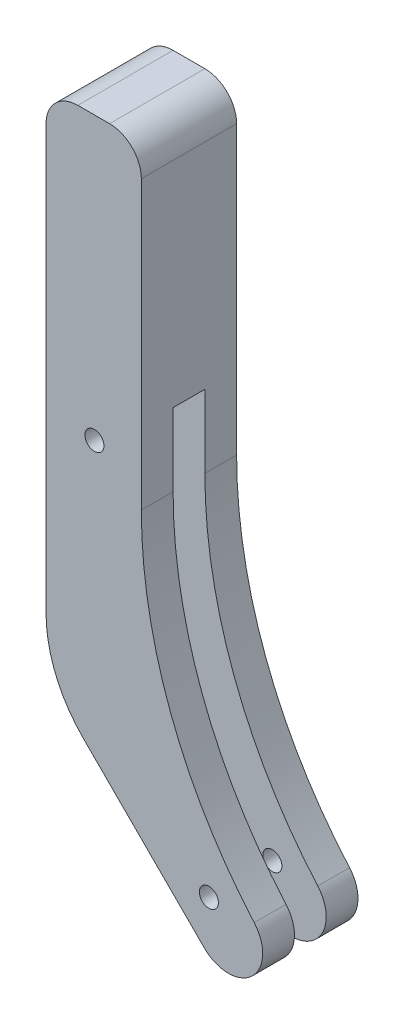
ISO-10303-21;
HEADER;
FILE_DESCRIPTION(('STEP AP214'),'2;1');
FILE_NAME('part.step','',(''),(''),'','','');
FILE_SCHEMA(('AUTOMOTIVE_DESIGN { 1 0 10303 214 1 1 1 1 }'));
ENDSEC;
DATA;
#1=APPLICATION_CONTEXT('core data for automotive mechanical design processes');
#2=APPLICATION_PROTOCOL_DEFINITION('international standard','automotive_design',2000,#1);
#3=PRODUCT_CONTEXT('',#1,'mechanical');
#4=PRODUCT('Part','Part','',(#3));
#5=PRODUCT_RELATED_PRODUCT_CATEGORY('part','',(#4));
#6=PRODUCT_DEFINITION_FORMATION('','',#4);
#7=PRODUCT_DEFINITION_CONTEXT('part definition',#1,'design');
#8=PRODUCT_DEFINITION('design','',#6,#7);
#9=PRODUCT_DEFINITION_SHAPE('','',#8);
#10=(LENGTH_UNIT() NAMED_UNIT(*) SI_UNIT(.MILLI.,.METRE.));
#11=(NAMED_UNIT(*) PLANE_ANGLE_UNIT() SI_UNIT($,.RADIAN.));
#12=(NAMED_UNIT(*) SI_UNIT($,.STERADIAN.) SOLID_ANGLE_UNIT());
#13=UNCERTAINTY_MEASURE_WITH_UNIT(LENGTH_MEASURE(1.E-05),#10,'distance_accuracy_value','');
#14=(GEOMETRIC_REPRESENTATION_CONTEXT(3) GLOBAL_UNCERTAINTY_ASSIGNED_CONTEXT((#13)) GLOBAL_UNIT_ASSIGNED_CONTEXT((#10,
#11,#12)) REPRESENTATION_CONTEXT('',''));
#15=CARTESIAN_POINT('',(0.,0.,0.));
#16=DIRECTION('',(0.,0.,1.));
#17=DIRECTION('',(1.,0.,0.));
#18=AXIS2_PLACEMENT_3D('',#15,#16,#17);
#19=CARTESIAN_POINT('',(32.7735875325626,-17.542182630838,5.49999999999998));
#20=CARTESIAN_POINT('',(32.7735875325626,-17.542182630838,5.33333333333328));
#21=CARTESIAN_POINT('',(32.7735875306768,-17.5421826286791,5.16666666666668));
#22=CARTESIAN_POINT('',(32.7735875306768,-17.5421826286791,3.33333333333311));
#23=CARTESIAN_POINT('',(32.7735875306768,-17.5421826286791,1.66666666666562));
#24=CARTESIAN_POINT('',(32.7735875306768,-17.5421826286791,-0.166666666666562));
#25=CARTESIAN_POINT('',(32.7735875325626,-17.542182630838,-0.333333333333409));
#26=CARTESIAN_POINT('',(32.7735875325626,-17.542182630838,-0.499999999999997));
#27=CARTESIAN_POINT('',(39.4151061792394,-25.1457185349327,5.49999999999998));
#28=CARTESIAN_POINT('',(39.4151061792394,-25.1457185349327,5.33333333333328));
#29=CARTESIAN_POINT('',(39.4151061848913,-25.1457185364542,5.16666666666668));
#30=CARTESIAN_POINT('',(39.4151061848913,-25.1457185364542,3.33333333333311));
#31=CARTESIAN_POINT('',(39.4151061848913,-25.1457185364542,1.66666666666562));
#32=CARTESIAN_POINT('',(39.4151061848913,-25.1457185364542,-0.166666666666562));
#33=CARTESIAN_POINT('',(39.4151061792394,-25.1457185349327,-0.333333333333409));
#34=CARTESIAN_POINT('',(39.4151061792394,-25.1457185349327,-0.499999999999997));
#35=CARTESIAN_POINT('',(32.0397712806244,-32.0397712838038,5.49999999999998));
#36=CARTESIAN_POINT('',(32.0397712806244,-32.0397712838038,5.33333333333328));
#37=CARTESIAN_POINT('',(32.0397712808825,-32.0397712898168,5.16666666666668));
#38=CARTESIAN_POINT('',(32.0397712808825,-32.0397712898168,3.33333333333311));
#39=CARTESIAN_POINT('',(32.0397712808825,-32.0397712898168,1.66666666666562));
#40=CARTESIAN_POINT('',(32.0397712808825,-32.0397712898168,-0.166666666666562));
#41=CARTESIAN_POINT('',(32.0397712806244,-32.0397712838038,-0.333333333333409));
#42=CARTESIAN_POINT('',(32.0397712806244,-32.0397712838038,-0.499999999999997));
#43=CARTESIAN_POINT('',(24.9010204048193,-24.9010204048192,5.49999999999998));
#44=CARTESIAN_POINT('',(24.9010204048193,-24.9010204048192,5.33333333333328));
#45=CARTESIAN_POINT('',(24.9010204024885,-24.9010204024884,5.16666666666668));
#46=CARTESIAN_POINT('',(24.9010204024885,-24.9010204024884,3.33333333333311));
#47=CARTESIAN_POINT('',(24.9010204024885,-24.9010204024884,1.66666666666562));
#48=CARTESIAN_POINT('',(24.9010204024885,-24.9010204024884,-0.166666666666562));
#49=CARTESIAN_POINT('',(24.9010204048193,-24.9010204048192,-0.333333333333409));
#50=CARTESIAN_POINT('',(24.9010204048193,-24.9010204048192,-0.499999999999997));
#51=(BOUNDED_SURFACE() B_SPLINE_SURFACE(3,3,((#19,#20,#21,#22,#23,#24,#25,#26),(#27,#28,#29,#30,
#31,#32,#33,#34),(#35,#36,#37,#38,#39,#40,#41,#42),(#43,#44,#45,#46,#47,#48,#49,#50)),
.UNSPECIFIED.,.F.,.F.,.F.) B_SPLINE_SURFACE_WITH_KNOTS((4,4),(4,2,2,4),(0.,1.),
(-0.0999999999999964,0.,1.,1.1),
.UNSPECIFIED.) GEOMETRIC_REPRESENTATION_ITEM() RATIONAL_B_SPLINE_SURFACE(((1.,1.,1.,1.,1.,1.,1.,
1.),(0.355806085913103,0.355806085913103,0.355806085671384,0.355806085671384,0.355806085671384,
0.355806085671384,0.355806085913103,0.355806085913103),(0.355806085913103,0.355806085913103,
0.355806085671384,0.355806085671384,0.355806085671384,0.355806085671384,0.355806085913103,
0.355806085913103),(1.,1.,1.,1.,1.,1.,1.,1.))) REPRESENTATION_ITEM('') SURFACE());
#52=CARTESIAN_POINT('',(24.9010204048193,-24.9010204048192,5.49999999999998));
#53=CARTESIAN_POINT('',(24.9010204048193,-24.9010204048192,5.33333333333328));
#54=CARTESIAN_POINT('',(24.9010204024885,-24.9010204024884,5.16666666666668));
#55=CARTESIAN_POINT('',(24.9010204024885,-24.9010204024884,3.33333333333311));
#56=CARTESIAN_POINT('',(24.9010204024885,-24.9010204024884,1.66666666666562));
#57=CARTESIAN_POINT('',(24.9010204024885,-24.9010204024884,-0.166666666666562));
#58=CARTESIAN_POINT('',(24.9010204048193,-24.9010204048192,-0.333333333333409));
#59=CARTESIAN_POINT('',(24.9010204048193,-24.9010204048192,-0.499999999999997));
#60=(BOUNDED_CURVE() B_SPLINE_CURVE(3,(#52,#53,#54,#55,#56,#57,#58,#59),.UNSPECIFIED.,.F.,
.F.) B_SPLINE_CURVE_WITH_KNOTS((4,2,2,4),(-0.0999999999999964,0.,1.,1.1),
.UNSPECIFIED.) CURVE() GEOMETRIC_REPRESENTATION_ITEM() RATIONAL_B_SPLINE_CURVE((1.,1.,1.,1.,1.,
1.,1.,1.)) REPRESENTATION_ITEM(''));
#61=CARTESIAN_POINT('',(24.9010204024885,-24.9010204024884,0.));
#62=VERTEX_POINT('',#61);
#63=CARTESIAN_POINT('',(24.9010204024885,-24.9010204024884,4.99999999999999));
#64=VERTEX_POINT('',#63);
#65=EDGE_CURVE('E233',#62,#64,#60,.F.);
#66=CARTESIAN_POINT('',(24.9010204024885,-24.9010204024884,0.));
#67=CARTESIAN_POINT('',(32.0397712808825,-32.0397712898168,0.));
#68=CARTESIAN_POINT('',(39.4151061848913,-25.1457185364542,0.));
#69=CARTESIAN_POINT('',(32.7735875306768,-17.5421826286791,0.));
#70=(BOUNDED_CURVE() B_SPLINE_CURVE(3,(#66,#67,#68,#69),.UNSPECIFIED.,.F.,
.F.) B_SPLINE_CURVE_WITH_KNOTS((4,4),(0.,1.),
.UNSPECIFIED.) CURVE() GEOMETRIC_REPRESENTATION_ITEM() RATIONAL_B_SPLINE_CURVE((1.,
0.355806085671384,0.355806085671384,1.)) REPRESENTATION_ITEM(''));
#71=CARTESIAN_POINT('',(32.7735875306768,-17.5421826286791,0.));
#72=VERTEX_POINT('',#71);
#73=EDGE_CURVE('E48',#72,#62,#70,.F.);
#74=CARTESIAN_POINT('',(32.7735875325626,-17.542182630838,-0.499999999999997));
#75=CARTESIAN_POINT('',(32.7735875325626,-17.542182630838,-0.333333333333409));
#76=CARTESIAN_POINT('',(32.7735875306768,-17.5421826286791,-0.166666666666562));
#77=CARTESIAN_POINT('',(32.7735875306768,-17.5421826286791,1.66666666666562));
#78=CARTESIAN_POINT('',(32.7735875306768,-17.5421826286791,3.33333333333311));
#79=CARTESIAN_POINT('',(32.7735875306768,-17.5421826286791,5.16666666666668));
#80=CARTESIAN_POINT('',(32.7735875325626,-17.542182630838,5.33333333333328));
#81=CARTESIAN_POINT('',(32.7735875325626,-17.542182630838,5.49999999999998));
#82=(BOUNDED_CURVE() B_SPLINE_CURVE(3,(#74,#75,#76,#77,#78,#79,#80,#81),.UNSPECIFIED.,.F.,
.F.) B_SPLINE_CURVE_WITH_KNOTS((4,2,2,4),(-0.0999999999999963,0.,1.,1.1),
.UNSPECIFIED.) CURVE() GEOMETRIC_REPRESENTATION_ITEM() RATIONAL_B_SPLINE_CURVE((1.,1.,1.,1.,1.,
1.,1.,1.)) REPRESENTATION_ITEM(''));
#83=CARTESIAN_POINT('',(32.7735875306768,-17.5421826286791,5.));
#84=VERTEX_POINT('',#83);
#85=EDGE_CURVE('E338',#84,#72,#82,.F.);
#86=CARTESIAN_POINT('',(32.7735875306768,-17.5421826286791,5.));
#87=CARTESIAN_POINT('',(39.4151061848913,-25.1457185364542,5.));
#88=CARTESIAN_POINT('',(32.0397712808825,-32.0397712898168,5.));
#89=CARTESIAN_POINT('',(24.9010204024885,-24.9010204024884,5.));
#90=(BOUNDED_CURVE() B_SPLINE_CURVE(3,(#86,#87,#88,#89),.UNSPECIFIED.,.F.,
.F.) B_SPLINE_CURVE_WITH_KNOTS((4,4),(0.,1.),
.UNSPECIFIED.) CURVE() GEOMETRIC_REPRESENTATION_ITEM() RATIONAL_B_SPLINE_CURVE((1.,
0.355806085671384,0.355806085671384,1.)) REPRESENTATION_ITEM(''));
#91=EDGE_CURVE('E11',#64,#84,#90,.F.);
#92=ORIENTED_EDGE('',*,*,#65,.F.);
#93=ORIENTED_EDGE('',*,*,#73,.F.);
#94=ORIENTED_EDGE('',*,*,#85,.F.);
#95=ORIENTED_EDGE('',*,*,#91,.F.);
#96=EDGE_LOOP('',(#92,#93,#94,#95));
#97=FACE_BOUND('',#96,.T.);
#98=ADVANCED_FACE('F35',(#97),#51,.T.);
#99=CARTESIAN_POINT('',(32.7735875325626,-17.542182630838,15.5));
#100=CARTESIAN_POINT('',(32.7735875325898,-17.5421826308692,15.3333333333344));
#101=CARTESIAN_POINT('',(32.7735875306469,-17.5421826286449,15.1666666666652));
#102=CARTESIAN_POINT('',(32.773587530976,-17.5421826290216,13.3333333333476));
#103=CARTESIAN_POINT('',(32.7735875333082,-17.5421826316916,11.6666666666671));
#104=CARTESIAN_POINT('',(32.7735875336341,-17.5421826320647,9.83333333333329));
#105=CARTESIAN_POINT('',(32.7735875335713,-17.5421826319928,9.66666666666674));
#106=CARTESIAN_POINT('',(32.7735875336045,-17.5421826320308,9.50000000000002));
#107=CARTESIAN_POINT('',(39.4151061792394,-25.1457185349327,15.5));
#108=CARTESIAN_POINT('',(39.4151061791578,-25.145718534909,15.3333333333327));
#109=CARTESIAN_POINT('',(39.4151061849821,-25.1457185364776,15.1666666666712));
#110=CARTESIAN_POINT('',(39.4151061839835,-25.14571853622,13.3333333336872));
#111=CARTESIAN_POINT('',(39.4151061769957,-25.1457185343147,11.6666666670207));
#112=CARTESIAN_POINT('',(39.4151061760289,-25.1457185340698,9.83333333333682));
#113=CARTESIAN_POINT('',(39.4151061762255,-25.1457185341164,9.66666666666674));
#114=CARTESIAN_POINT('',(39.4151061761168,-25.1457185340921,9.50000000000002));
#115=CARTESIAN_POINT('',(32.0397712806244,-32.0397712838038,15.5));
#116=CARTESIAN_POINT('',(32.0397712806221,-32.0397712837165,15.3333333333327));
#117=CARTESIAN_POINT('',(32.0397712808877,-32.0397712899128,15.1666666666712));
#118=CARTESIAN_POINT('',(32.0397712808304,-32.0397712888569,13.3333333336872));
#119=CARTESIAN_POINT('',(32.0397712805338,-32.0397712814126,11.6666666670207));
#120=CARTESIAN_POINT('',(32.0397712804766,-32.0397712803886,9.83333333333682));
#121=CARTESIAN_POINT('',(32.0397712804968,-32.0397712805927,9.66666666666674));
#122=CARTESIAN_POINT('',(32.0397712804818,-32.0397712804817,9.50000000000002));
#123=CARTESIAN_POINT('',(24.9010204048193,-24.9010204048192,15.5));
#124=CARTESIAN_POINT('',(24.9010204048543,-24.9010204048542,15.3333333333344));
#125=CARTESIAN_POINT('',(24.901020402452,-24.9010204024519,15.1666666666652));
#126=CARTESIAN_POINT('',(24.9010204028528,-24.9010204028527,13.3333333333476));
#127=CARTESIAN_POINT('',(24.9010204057514,-24.9010204057513,11.6666666666671));
#128=CARTESIAN_POINT('',(24.9010204061426,-24.9010204061425,9.83333333333329));
#129=CARTESIAN_POINT('',(24.9010204060712,-24.9010204060711,9.66666666666674));
#130=CARTESIAN_POINT('',(24.901020406107,-24.9010204061069,9.50000000000002));
#131=(BOUNDED_SURFACE() B_SPLINE_SURFACE(3,3,((#99,#100,#101,#102,#103,#104,#105,#106),(#107,
#108,#109,#110,#111,#112,#113,#114),(#115,#116,#117,#118,#119,#120,#121,#122),(#123,#124,#125,
#126,#127,#128,#129,#130)),.UNSPECIFIED.,.F.,.F.,.F.) B_SPLINE_SURFACE_WITH_KNOTS((4,4),(4,2,2,
4),(0.,1.),(-0.0999999999999996,0.,0.999999999999996,1.1),
.UNSPECIFIED.) GEOMETRIC_REPRESENTATION_ITEM() RATIONAL_B_SPLINE_SURFACE(((1.,1.,1.,1.,1.,1.,1.,
1.),(0.355806085913103,0.355806085913103,0.35580608566364,0.355806085748822,0.355806085971154,
0.355806086054199,0.355806086046649,0.355806086046649),(0.355806085913103,0.355806085913103,
0.35580608566364,0.355806085748822,0.355806085971154,0.355806086054199,0.355806086046649,
0.355806086046649),(1.,1.,1.,1.,1.,1.,1.,1.))) REPRESENTATION_ITEM('') SURFACE());
#132=CARTESIAN_POINT('',(24.9010204048193,-24.9010204048192,15.5));
#133=CARTESIAN_POINT('',(24.9010204048543,-24.9010204048542,15.3333333333344));
#134=CARTESIAN_POINT('',(24.901020402452,-24.9010204024519,15.1666666666652));
#135=CARTESIAN_POINT('',(24.9010204028528,-24.9010204028527,13.3333333333476));
#136=CARTESIAN_POINT('',(24.9010204057514,-24.9010204057513,11.6666666666671));
#137=CARTESIAN_POINT('',(24.9010204061426,-24.9010204061425,9.83333333333329));
#138=CARTESIAN_POINT('',(24.9010204060712,-24.9010204060711,9.66666666666674));
#139=CARTESIAN_POINT('',(24.901020406107,-24.9010204061069,9.50000000000002));
#140=(BOUNDED_CURVE() B_SPLINE_CURVE(3,(#132,#133,#134,#135,#136,#137,#138,#139),.UNSPECIFIED.,
.F.,.F.) B_SPLINE_CURVE_WITH_KNOTS((4,2,2,4),(-0.0999999999999996,0.,0.999999999999996,1.1),
.UNSPECIFIED.) CURVE() GEOMETRIC_REPRESENTATION_ITEM() RATIONAL_B_SPLINE_CURVE((1.,1.,1.,1.,1.,
1.,1.,1.)) REPRESENTATION_ITEM(''));
#141=CARTESIAN_POINT('',(24.901020406107,-24.9010204061069,9.99999999999999));
#142=VERTEX_POINT('',#141);
#143=CARTESIAN_POINT('',(24.9010204024885,-24.9010204024884,15.));
#144=VERTEX_POINT('',#143);
#145=EDGE_CURVE('E321',#142,#144,#140,.F.);
#146=CARTESIAN_POINT('',(24.901020406107,-24.9010204061069,10.));
#147=CARTESIAN_POINT('',(32.0397712804818,-32.0397712804817,10.));
#148=CARTESIAN_POINT('',(39.4151061761168,-25.1457185340921,10.));
#149=CARTESIAN_POINT('',(32.7735875336045,-17.5421826320308,10.));
#150=(BOUNDED_CURVE() B_SPLINE_CURVE(3,(#146,#147,#148,#149),.UNSPECIFIED.,.F.,
.F.) B_SPLINE_CURVE_WITH_KNOTS((4,4),(0.,1.),
.UNSPECIFIED.) CURVE() GEOMETRIC_REPRESENTATION_ITEM() RATIONAL_B_SPLINE_CURVE((1.,
0.35580608604665,0.35580608604665,1.)) REPRESENTATION_ITEM(''));
#151=CARTESIAN_POINT('',(32.7735875336045,-17.5421826320308,10.));
#152=VERTEX_POINT('',#151);
#153=EDGE_CURVE('E329',#152,#142,#150,.F.);
#154=CARTESIAN_POINT('',(32.7735875336045,-17.5421826320308,9.50000000000002));
#155=CARTESIAN_POINT('',(32.7735875335713,-17.5421826319928,9.66666666666674));
#156=CARTESIAN_POINT('',(32.7735875336341,-17.5421826320647,9.83333333333329));
#157=CARTESIAN_POINT('',(32.7735875333082,-17.5421826316916,11.6666666666671));
#158=CARTESIAN_POINT('',(32.773587530976,-17.5421826290216,13.3333333333476));
#159=CARTESIAN_POINT('',(32.7735875306469,-17.5421826286449,15.1666666666652));
#160=CARTESIAN_POINT('',(32.7735875325898,-17.5421826308692,15.3333333333344));
#161=CARTESIAN_POINT('',(32.7735875325626,-17.542182630838,15.5));
#162=(BOUNDED_CURVE() B_SPLINE_CURVE(3,(#154,#155,#156,#157,#158,#159,#160,#161),.UNSPECIFIED.,
.F.,.F.) B_SPLINE_CURVE_WITH_KNOTS((4,2,2,4),(-0.0999999999999996,0.,0.999999999999996,1.1),
.UNSPECIFIED.) CURVE() GEOMETRIC_REPRESENTATION_ITEM() RATIONAL_B_SPLINE_CURVE((1.,1.,1.,1.,1.,
1.,1.,1.)) REPRESENTATION_ITEM(''));
#163=CARTESIAN_POINT('',(32.7735875306768,-17.5421826286791,15.));
#164=VERTEX_POINT('',#163);
#165=EDGE_CURVE('E324',#164,#152,#162,.F.);
#166=CARTESIAN_POINT('',(32.7735875306768,-17.5421826286791,15.));
#167=CARTESIAN_POINT('',(39.4151061848913,-25.1457185364542,15.));
#168=CARTESIAN_POINT('',(32.0397712808825,-32.0397712898168,15.));
#169=CARTESIAN_POINT('',(24.9010204024885,-24.9010204024884,15.));
#170=(BOUNDED_CURVE() B_SPLINE_CURVE(3,(#166,#167,#168,#169),.UNSPECIFIED.,.F.,
.F.) B_SPLINE_CURVE_WITH_KNOTS((4,4),(0.,1.),
.UNSPECIFIED.) CURVE() GEOMETRIC_REPRESENTATION_ITEM() RATIONAL_B_SPLINE_CURVE((1.,
0.355806085671384,0.355806085671384,1.)) REPRESENTATION_ITEM(''));
#171=EDGE_CURVE('E334',#144,#164,#170,.F.);
#172=ORIENTED_EDGE('',*,*,#145,.F.);
#173=ORIENTED_EDGE('',*,*,#153,.F.);
#174=ORIENTED_EDGE('',*,*,#165,.F.);
#175=ORIENTED_EDGE('',*,*,#171,.F.);
#176=EDGE_LOOP('',(#172,#173,#174,#175));
#177=FACE_BOUND('',#176,.T.);
#178=ADVANCED_FACE('F252',(#177),#131,.T.);
#179=CARTESIAN_POINT('',(28.7132034355965,-28.7132034355964,15.));
#180=DIRECTION('',(0.707106781186546,0.707106781186549,0.));
#181=DIRECTION('',(-0.707106781186549,0.707106781186546,0.));
#182=AXIS2_PLACEMENT_3D('',#179,#180,#181);
#183=PLANE('',#182);
#184=DIRECTION('',(0.707106781186549,-0.707106781186546,0.));
#185=VECTOR('',#184,1.);
#186=CARTESIAN_POINT('',(28.7132034355965,-28.7132034355964,0.));
#187=LINE('',#186,#185);
#188=CARTESIAN_POINT('',(5.85786437626907,-5.85786437626905,0.));
#189=VERTEX_POINT('',#188);
#190=EDGE_CURVE('E222',#189,#62,#187,.T.);
#191=ORIENTED_EDGE('',*,*,#190,.T.);
#192=ORIENTED_EDGE('',*,*,#65,.T.);
#193=DIRECTION('',(0.707106781186549,-0.707106781186546,0.));
#194=VECTOR('',#193,1.);
#195=CARTESIAN_POINT('',(28.7132034355965,-28.7132034355964,4.99999999999999));
#196=LINE('',#195,#194);
#197=CARTESIAN_POINT('',(5.85786437626907,-5.85786437626905,5.));
#198=VERTEX_POINT('',#197);
#199=EDGE_CURVE('E226',#198,#64,#196,.T.);
#200=ORIENTED_EDGE('',*,*,#199,.F.);
#201=DIRECTION('',(0.,0.,-1.));
#202=VECTOR('',#201,1.);
#203=CARTESIAN_POINT('',(5.85786437626907,-5.85786437626905,15.));
#204=LINE('',#203,#202);
#205=EDGE_CURVE('E273',#198,#189,#204,.T.);
#206=ORIENTED_EDGE('',*,*,#205,.T.);
#207=EDGE_LOOP('',(#191,#192,#200,#206));
#208=FACE_BOUND('',#207,.T.);
#209=ADVANCED_FACE('F241',(#208),#183,.F.);
#210=DIRECTION('',(-0.707106781186549,0.707106781186546,0.));
#211=VECTOR('',#210,1.);
#212=CARTESIAN_POINT('',(28.7132034355965,-28.7132034355964,9.99999999999999));
#213=LINE('',#212,#211);
#214=CARTESIAN_POINT('',(5.85786437626907,-5.85786437626905,10.));
#215=VERTEX_POINT('',#214);
#216=EDGE_CURVE('E160',#142,#215,#213,.T.);
#217=ORIENTED_EDGE('',*,*,#216,.F.);
#218=ORIENTED_EDGE('',*,*,#145,.T.);
#219=DIRECTION('',(0.707106781186549,-0.707106781186546,0.));
#220=VECTOR('',#219,1.);
#221=CARTESIAN_POINT('',(28.7132034355965,-28.7132034355964,15.));
#222=LINE('',#221,#220);
#223=CARTESIAN_POINT('',(5.85786437626907,-5.85786437626905,15.));
#224=VERTEX_POINT('',#223);
#225=EDGE_CURVE('E196',#224,#144,#222,.T.);
#226=ORIENTED_EDGE('',*,*,#225,.F.);
#227=EDGE_CURVE('E282',#224,#215,#204,.T.);
#228=ORIENTED_EDGE('',*,*,#227,.T.);
#229=EDGE_LOOP('',(#217,#218,#226,#228));
#230=FACE_BOUND('',#229,.T.);
#231=ADVANCED_FACE('F251',(#230),#183,.F.);
#232=CARTESIAN_POINT('',(15.,80.,15.));
#233=DIRECTION('',(-1.,0.,0.));
#234=DIRECTION('',(0.,0.,1.));
#235=AXIS2_PLACEMENT_3D('',#232,#233,#234);
#236=PLANE('',#235);
#237=DIRECTION('',(0.,1.,0.));
#238=VECTOR('',#237,1.);
#239=CARTESIAN_POINT('',(15.,80.,0.));
#240=LINE('',#239,#238);
#241=CARTESIAN_POINT('',(15.,29.8233764908629,0.));
#242=VERTEX_POINT('',#241);
#243=CARTESIAN_POINT('',(15.,75.,0.));
#244=VERTEX_POINT('',#243);
#245=EDGE_CURVE('E219',#242,#244,#240,.T.);
#246=ORIENTED_EDGE('',*,*,#245,.T.);
#247=DIRECTION('',(0.,0.,-1.));
#248=VECTOR('',#247,1.);
#249=CARTESIAN_POINT('',(15.,75.,15.));
#250=LINE('',#249,#248);
#251=CARTESIAN_POINT('',(15.,75.,15.));
#252=VERTEX_POINT('',#251);
#253=EDGE_CURVE('E313',#244,#252,#250,.F.);
#254=ORIENTED_EDGE('',*,*,#253,.T.);
#255=DIRECTION('',(0.,1.,0.));
#256=VECTOR('',#255,1.);
#257=CARTESIAN_POINT('',(15.,80.,15.));
#258=LINE('',#257,#256);
#259=CARTESIAN_POINT('',(15.,29.8233764908629,15.));
#260=VERTEX_POINT('',#259);
#261=EDGE_CURVE('E200',#260,#252,#258,.T.);
#262=ORIENTED_EDGE('',*,*,#261,.F.);
#263=DIRECTION('',(0.,0.,-1.));
#264=VECTOR('',#263,1.);
#265=CARTESIAN_POINT('',(15.,29.8233764908629,0.));
#266=LINE('',#265,#264);
#267=CARTESIAN_POINT('',(15.,29.8233764908629,10.));
#268=VERTEX_POINT('',#267);
#269=EDGE_CURVE('E362',#260,#268,#266,.T.);
#270=ORIENTED_EDGE('',*,*,#269,.T.);
#271=DIRECTION('',(0.,-1.,0.));
#272=VECTOR('',#271,1.);
#273=CARTESIAN_POINT('',(15.,80.,10.));
#274=LINE('',#273,#272);
#275=CARTESIAN_POINT('',(15.,41.2867965644036,10.));
#276=VERTEX_POINT('',#275);
#277=EDGE_CURVE('E269',#276,#268,#274,.T.);
#278=ORIENTED_EDGE('',*,*,#277,.F.);
#279=DIRECTION('',(0.,0.,1.));
#280=VECTOR('',#279,1.);
#281=CARTESIAN_POINT('',(15.,41.2867965644036,15.));
#282=LINE('',#281,#280);
#283=CARTESIAN_POINT('',(15.,41.2867965644036,5.00000000000001));
#284=VERTEX_POINT('',#283);
#285=EDGE_CURVE('E207',#284,#276,#282,.T.);
#286=ORIENTED_EDGE('',*,*,#285,.F.);
#287=DIRECTION('',(0.,1.,0.));
#288=VECTOR('',#287,1.);
#289=CARTESIAN_POINT('',(15.,80.,5.00000000000001));
#290=LINE('',#289,#288);
#291=CARTESIAN_POINT('',(15.,29.8233764908629,5.));
#292=VERTEX_POINT('',#291);
#293=EDGE_CURVE('E157',#292,#284,#290,.T.);
#294=ORIENTED_EDGE('',*,*,#293,.F.);
#295=EDGE_CURVE('E216',#292,#242,#266,.T.);
#296=ORIENTED_EDGE('',*,*,#295,.T.);
#297=EDGE_LOOP('',(#246,#254,#262,#270,#278,#286,#294,#296));
#298=FACE_BOUND('',#297,.T.);
#299=ADVANCED_FACE('F253',(#298),#236,.F.);
#300=CARTESIAN_POINT('',(0.,0.,15.));
#301=DIRECTION('',(1.,0.,0.));
#302=DIRECTION('',(0.,0.,-1.));
#303=AXIS2_PLACEMENT_3D('',#300,#301,#302);
#304=PLANE('',#303);
#305=DIRECTION('',(0.,-1.,0.));
#306=VECTOR('',#305,1.);
#307=CARTESIAN_POINT('',(0.,0.,15.));
#308=LINE('',#307,#306);
#309=CARTESIAN_POINT('',(0.,75.,15.));
#310=VERTEX_POINT('',#309);
#311=CARTESIAN_POINT('',(0.,8.28427124746193,15.));
#312=VERTEX_POINT('',#311);
#313=EDGE_CURVE('E214',#310,#312,#308,.T.);
#314=ORIENTED_EDGE('',*,*,#313,.F.);
#315=DIRECTION('',(0.,0.,-1.));
#316=VECTOR('',#315,1.);
#317=CARTESIAN_POINT('',(0.,75.,15.));
#318=LINE('',#317,#316);
#319=CARTESIAN_POINT('',(0.,75.,0.));
#320=VERTEX_POINT('',#319);
#321=EDGE_CURVE('E194',#310,#320,#318,.T.);
#322=ORIENTED_EDGE('',*,*,#321,.T.);
#323=DIRECTION('',(0.,-1.,0.));
#324=VECTOR('',#323,1.);
#325=CARTESIAN_POINT('',(0.,0.,0.));
#326=LINE('',#325,#324);
#327=CARTESIAN_POINT('',(0.,8.28427124746193,0.));
#328=VERTEX_POINT('',#327);
#329=EDGE_CURVE('E201',#320,#328,#326,.T.);
#330=ORIENTED_EDGE('',*,*,#329,.T.);
#331=DIRECTION('',(0.,0.,-1.));
#332=VECTOR('',#331,1.);
#333=CARTESIAN_POINT('',(0.,8.28427124746193,15.));
#334=LINE('',#333,#332);
#335=CARTESIAN_POINT('',(0.,8.28427124746193,5.));
#336=VERTEX_POINT('',#335);
#337=EDGE_CURVE('E176',#328,#336,#334,.F.);
#338=ORIENTED_EDGE('',*,*,#337,.T.);
#339=DIRECTION('',(0.,1.,0.));
#340=VECTOR('',#339,1.);
#341=CARTESIAN_POINT('',(0.,41.2867965644036,5.00000000000001));
#342=LINE('',#341,#340);
#343=CARTESIAN_POINT('',(0.,41.2867965644036,5.00000000000001));
#344=VERTEX_POINT('',#343);
#345=EDGE_CURVE('E154',#336,#344,#342,.T.);
#346=ORIENTED_EDGE('',*,*,#345,.T.);
#347=DIRECTION('',(0.,0.,1.));
#348=VECTOR('',#347,1.);
#349=CARTESIAN_POINT('',(0.,41.2867965644036,10.));
#350=LINE('',#349,#348);
#351=CARTESIAN_POINT('',(0.,41.2867965644036,10.));
#352=VERTEX_POINT('',#351);
#353=EDGE_CURVE('E164',#344,#352,#350,.T.);
#354=ORIENTED_EDGE('',*,*,#353,.T.);
#355=DIRECTION('',(0.,-1.,0.));
#356=VECTOR('',#355,1.);
#357=CARTESIAN_POINT('',(0.,41.2867965644036,10.));
#358=LINE('',#357,#356);
#359=CARTESIAN_POINT('',(0.,8.28427124746193,10.));
#360=VERTEX_POINT('',#359);
#361=EDGE_CURVE('E170',#352,#360,#358,.T.);
#362=ORIENTED_EDGE('',*,*,#361,.T.);
#363=EDGE_CURVE('E288',#360,#312,#334,.F.);
#364=ORIENTED_EDGE('',*,*,#363,.T.);
#365=EDGE_LOOP('',(#314,#322,#330,#338,#346,#354,#362,#364));
#366=FACE_BOUND('',#365,.T.);
#367=ADVANCED_FACE('F174',(#366),#304,.F.);
#368=CARTESIAN_POINT('',(87.,29.8233764908629,15.));
#369=DIRECTION('',(0.,0.,1.));
#370=DIRECTION('',(1.,0.,0.));
#371=AXIS2_PLACEMENT_3D('',#368,#369,#370);
#372=CYLINDRICAL_SURFACE('',#371,72.);
#373=CARTESIAN_POINT('',(87.,29.8233764908629,5.));
#374=DIRECTION('',(0.,0.,1.));
#375=DIRECTION('',(0.,-1.,0.));
#376=AXIS2_PLACEMENT_3D('',#373,#374,#375);
#377=CIRCLE('',#376,72.);
#378=EDGE_CURVE('E238',#84,#292,#377,.F.);
#379=ORIENTED_EDGE('',*,*,#378,.F.);
#380=ORIENTED_EDGE('',*,*,#85,.T.);
#381=CARTESIAN_POINT('',(87.,29.8233764908629,0.));
#382=DIRECTION('',(0.,0.,1.));
#383=DIRECTION('',(1.,0.,0.));
#384=AXIS2_PLACEMENT_3D('',#381,#382,#383);
#385=CIRCLE('',#384,72.);
#386=EDGE_CURVE('E274',#242,#72,#385,.T.);
#387=ORIENTED_EDGE('',*,*,#386,.F.);
#388=ORIENTED_EDGE('',*,*,#295,.F.);
#389=EDGE_LOOP('',(#379,#380,#387,#388));
#390=FACE_BOUND('',#389,.T.);
#391=ADVANCED_FACE('F255',(#390),#372,.F.);
#392=CARTESIAN_POINT('',(87.,29.8233764908629,15.));
#393=DIRECTION('',(0.,0.,1.));
#394=DIRECTION('',(1.,0.,0.));
#395=AXIS2_PLACEMENT_3D('',#392,#393,#394);
#396=CIRCLE('',#395,72.);
#397=EDGE_CURVE('E270',#164,#260,#396,.F.);
#398=ORIENTED_EDGE('',*,*,#397,.F.);
#399=ORIENTED_EDGE('',*,*,#165,.T.);
#400=CARTESIAN_POINT('',(87.,29.8233764908629,10.));
#401=DIRECTION('',(0.,0.,-1.));
#402=DIRECTION('',(0.,1.,0.));
#403=AXIS2_PLACEMENT_3D('',#400,#401,#402);
#404=CIRCLE('',#403,72.);
#405=EDGE_CURVE('E193',#268,#152,#404,.F.);
#406=ORIENTED_EDGE('',*,*,#405,.F.);
#407=ORIENTED_EDGE('',*,*,#269,.F.);
#408=EDGE_LOOP('',(#398,#399,#406,#407));
#409=FACE_BOUND('',#408,.T.);
#410=ADVANCED_FACE('F433',(#409),#372,.F.);
#411=CARTESIAN_POINT('',(20.,8.28427124746193,15.));
#412=DIRECTION('',(0.,0.,-1.));
#413=DIRECTION('',(-1.,0.,0.));
#414=AXIS2_PLACEMENT_3D('',#411,#412,#413);
#415=CYLINDRICAL_SURFACE('',#414,20.);
#416=ORIENTED_EDGE('',*,*,#205,.F.);
#417=CARTESIAN_POINT('',(20.,8.28427124746193,5.));
#418=DIRECTION('',(0.,0.,1.));
#419=DIRECTION('',(0.,-1.,0.));
#420=AXIS2_PLACEMENT_3D('',#417,#418,#419);
#421=CIRCLE('',#420,20.);
#422=EDGE_CURVE('E295',#198,#336,#421,.F.);
#423=ORIENTED_EDGE('',*,*,#422,.T.);
#424=ORIENTED_EDGE('',*,*,#337,.F.);
#425=CARTESIAN_POINT('',(20.,8.28427124746193,0.));
#426=DIRECTION('',(0.,0.,1.));
#427=DIRECTION('',(1.,0.,0.));
#428=AXIS2_PLACEMENT_3D('',#425,#426,#427);
#429=CIRCLE('',#428,20.);
#430=EDGE_CURVE('E285',#189,#328,#429,.F.);
#431=ORIENTED_EDGE('',*,*,#430,.F.);
#432=EDGE_LOOP('',(#416,#423,#424,#431));
#433=FACE_BOUND('',#432,.T.);
#434=ADVANCED_FACE('F357',(#433),#415,.T.);
#435=ORIENTED_EDGE('',*,*,#363,.F.);
#436=CARTESIAN_POINT('',(20.,8.28427124746193,10.));
#437=DIRECTION('',(0.,0.,-1.));
#438=DIRECTION('',(0.,1.,0.));
#439=AXIS2_PLACEMENT_3D('',#436,#437,#438);
#440=CIRCLE('',#439,20.);
#441=EDGE_CURVE('E292',#360,#215,#440,.F.);
#442=ORIENTED_EDGE('',*,*,#441,.T.);
#443=ORIENTED_EDGE('',*,*,#227,.F.);
#444=CARTESIAN_POINT('',(20.,8.28427124746193,15.));
#445=DIRECTION('',(0.,0.,1.));
#446=DIRECTION('',(1.,0.,0.));
#447=AXIS2_PLACEMENT_3D('',#444,#445,#446);
#448=CIRCLE('',#447,20.);
#449=EDGE_CURVE('E290',#312,#224,#448,.T.);
#450=ORIENTED_EDGE('',*,*,#449,.F.);
#451=EDGE_LOOP('',(#435,#442,#443,#450));
#452=FACE_BOUND('',#451,.T.);
#453=ADVANCED_FACE('F441',(#452),#415,.T.);
#454=CARTESIAN_POINT('',(0.,80.,15.));
#455=DIRECTION('',(0.,-1.,0.));
#456=DIRECTION('',(0.,0.,-1.));
#457=AXIS2_PLACEMENT_3D('',#454,#455,#456);
#458=PLANE('',#457);
#459=DIRECTION('',(-1.,0.,0.));
#460=VECTOR('',#459,1.);
#461=CARTESIAN_POINT('',(0.,80.,15.));
#462=LINE('',#461,#460);
#463=CARTESIAN_POINT('',(10.,80.,15.));
#464=VERTEX_POINT('',#463);
#465=CARTESIAN_POINT('',(5.,80.,15.));
#466=VERTEX_POINT('',#465);
#467=EDGE_CURVE('E211',#464,#466,#462,.T.);
#468=ORIENTED_EDGE('',*,*,#467,.F.);
#469=DIRECTION('',(0.,0.,-1.));
#470=VECTOR('',#469,1.);
#471=CARTESIAN_POINT('',(10.,80.,15.));
#472=LINE('',#471,#470);
#473=CARTESIAN_POINT('',(10.,80.,0.));
#474=VERTEX_POINT('',#473);
#475=EDGE_CURVE('E306',#464,#474,#472,.T.);
#476=ORIENTED_EDGE('',*,*,#475,.T.);
#477=DIRECTION('',(-1.,0.,0.));
#478=VECTOR('',#477,1.);
#479=CARTESIAN_POINT('',(0.,80.,0.));
#480=LINE('',#479,#478);
#481=CARTESIAN_POINT('',(5.,80.,0.));
#482=VERTEX_POINT('',#481);
#483=EDGE_CURVE('E360',#474,#482,#480,.T.);
#484=ORIENTED_EDGE('',*,*,#483,.T.);
#485=DIRECTION('',(0.,0.,-1.));
#486=VECTOR('',#485,1.);
#487=CARTESIAN_POINT('',(5.,80.,15.));
#488=LINE('',#487,#486);
#489=EDGE_CURVE('E297',#482,#466,#488,.F.);
#490=ORIENTED_EDGE('',*,*,#489,.T.);
#491=EDGE_LOOP('',(#468,#476,#484,#490));
#492=FACE_BOUND('',#491,.T.);
#493=ADVANCED_FACE('F375',(#492),#458,.F.);
#494=CARTESIAN_POINT('',(0.,0.,15.));
#495=DIRECTION('',(0.,0.,1.));
#496=DIRECTION('',(1.,0.,0.));
#497=AXIS2_PLACEMENT_3D('',#494,#495,#496);
#498=PLANE('',#497);
#499=CARTESIAN_POINT('',(7.61728785015164,35.6306026001601,15.));
#500=DIRECTION('',(0.,0.,1.));
#501=DIRECTION('',(1.,0.,0.));
#502=AXIS2_PLACEMENT_3D('',#499,#500,#501);
#503=CIRCLE('',#502,1.5);
#504=CARTESIAN_POINT('',(9.11728785015164,35.6306026001601,15.));
#505=VERTEX_POINT('',#504);
#506=EDGE_CURVE('E649',#505,#505,#503,.T.);
#507=ORIENTED_EDGE('',*,*,#506,.F.);
#508=EDGE_LOOP('',(#507));
#509=FACE_BOUND('',#508,.T.);
#510=CARTESIAN_POINT('',(25.6301753358751,-17.6540959115869,15.));
#511=DIRECTION('',(0.,0.,1.));
#512=DIRECTION('',(1.,0.,0.));
#513=AXIS2_PLACEMENT_3D('',#510,#511,#512);
#514=CIRCLE('',#513,1.5);
#515=CARTESIAN_POINT('',(27.1301753358751,-17.6540959115869,15.));
#516=VERTEX_POINT('',#515);
#517=EDGE_CURVE('E657',#516,#516,#514,.T.);
#518=ORIENTED_EDGE('',*,*,#517,.F.);
#519=EDGE_LOOP('',(#518));
#520=FACE_BOUND('',#519,.T.);
#521=ORIENTED_EDGE('',*,*,#225,.T.);
#522=ORIENTED_EDGE('',*,*,#171,.T.);
#523=ORIENTED_EDGE('',*,*,#397,.T.);
#524=ORIENTED_EDGE('',*,*,#261,.T.);
#525=CARTESIAN_POINT('',(10.,75.,15.));
#526=DIRECTION('',(0.,0.,1.));
#527=DIRECTION('',(1.,0.,0.));
#528=AXIS2_PLACEMENT_3D('',#525,#526,#527);
#529=CIRCLE('',#528,5.);
#530=EDGE_CURVE('E316',#252,#464,#529,.T.);
#531=ORIENTED_EDGE('',*,*,#530,.T.);
#532=ORIENTED_EDGE('',*,*,#467,.T.);
#533=CARTESIAN_POINT('',(5.,75.,15.));
#534=DIRECTION('',(0.,0.,1.));
#535=DIRECTION('',(1.,0.,0.));
#536=AXIS2_PLACEMENT_3D('',#533,#534,#535);
#537=CIRCLE('',#536,5.);
#538=EDGE_CURVE('E315',#466,#310,#537,.T.);
#539=ORIENTED_EDGE('',*,*,#538,.T.);
#540=ORIENTED_EDGE('',*,*,#313,.T.);
#541=ORIENTED_EDGE('',*,*,#449,.T.);
#542=EDGE_LOOP('',(#521,#522,#523,#524,#531,#532,#539,#540,#541));
#543=FACE_BOUND('',#542,.T.);
#544=ADVANCED_FACE('F378',(#509,#520,#543),#498,.T.);
#545=CARTESIAN_POINT('',(0.,0.,0.));
#546=DIRECTION('',(0.,0.,1.));
#547=DIRECTION('',(1.,0.,0.));
#548=AXIS2_PLACEMENT_3D('',#545,#546,#547);
#549=PLANE('',#548);
#550=CARTESIAN_POINT('',(7.61728785015164,35.6306026001601,0.));
#551=DIRECTION('',(0.,0.,1.));
#552=DIRECTION('',(1.,0.,0.));
#553=AXIS2_PLACEMENT_3D('',#550,#551,#552);
#554=CIRCLE('',#553,1.5);
#555=CARTESIAN_POINT('',(9.11728785015164,35.6306026001601,0.));
#556=VERTEX_POINT('',#555);
#557=EDGE_CURVE('E302',#556,#556,#554,.T.);
#558=ORIENTED_EDGE('',*,*,#557,.T.);
#559=EDGE_LOOP('',(#558));
#560=FACE_BOUND('',#559,.T.);
#561=CARTESIAN_POINT('',(25.6301753358751,-17.6540959115869,0.));
#562=DIRECTION('',(0.,0.,1.));
#563=DIRECTION('',(1.,0.,0.));
#564=AXIS2_PLACEMENT_3D('',#561,#562,#563);
#565=CIRCLE('',#564,1.5);
#566=CARTESIAN_POINT('',(27.1301753358751,-17.6540959115869,0.));
#567=VERTEX_POINT('',#566);
#568=EDGE_CURVE('E652',#567,#567,#565,.T.);
#569=ORIENTED_EDGE('',*,*,#568,.T.);
#570=EDGE_LOOP('',(#569));
#571=FACE_BOUND('',#570,.T.);
#572=ORIENTED_EDGE('',*,*,#386,.T.);
#573=ORIENTED_EDGE('',*,*,#73,.T.);
#574=ORIENTED_EDGE('',*,*,#190,.F.);
#575=ORIENTED_EDGE('',*,*,#430,.T.);
#576=ORIENTED_EDGE('',*,*,#329,.F.);
#577=CARTESIAN_POINT('',(5.,75.,0.));
#578=DIRECTION('',(0.,0.,1.));
#579=DIRECTION('',(1.,0.,0.));
#580=AXIS2_PLACEMENT_3D('',#577,#578,#579);
#581=CIRCLE('',#580,5.);
#582=EDGE_CURVE('E309',#320,#482,#581,.F.);
#583=ORIENTED_EDGE('',*,*,#582,.T.);
#584=ORIENTED_EDGE('',*,*,#483,.F.);
#585=CARTESIAN_POINT('',(10.,75.,0.));
#586=DIRECTION('',(0.,0.,1.));
#587=DIRECTION('',(1.,0.,0.));
#588=AXIS2_PLACEMENT_3D('',#585,#586,#587);
#589=CIRCLE('',#588,5.);
#590=EDGE_CURVE('E311',#474,#244,#589,.F.);
#591=ORIENTED_EDGE('',*,*,#590,.T.);
#592=ORIENTED_EDGE('',*,*,#245,.F.);
#593=EDGE_LOOP('',(#572,#573,#574,#575,#576,#583,#584,#591,#592));
#594=FACE_BOUND('',#593,.T.);
#595=ADVANCED_FACE('F347',(#560,#571,#594),#549,.F.);
#596=CARTESIAN_POINT('',(36.2132034355965,41.2867965644036,10.));
#597=DIRECTION('',(0.,-1.,0.));
#598=DIRECTION('',(0.,0.,-1.));
#599=AXIS2_PLACEMENT_3D('',#596,#597,#598);
#600=PLANE('',#599);
#601=ORIENTED_EDGE('',*,*,#285,.T.);
#602=DIRECTION('',(-1.,0.,0.));
#603=VECTOR('',#602,1.);
#604=CARTESIAN_POINT('',(36.2132034355965,41.2867965644036,10.));
#605=LINE('',#604,#603);
#606=EDGE_CURVE('E161',#276,#352,#605,.T.);
#607=ORIENTED_EDGE('',*,*,#606,.T.);
#608=ORIENTED_EDGE('',*,*,#353,.F.);
#609=DIRECTION('',(-1.,0.,0.));
#610=VECTOR('',#609,1.);
#611=CARTESIAN_POINT('',(36.2132034355965,41.2867965644036,5.00000000000001));
#612=LINE('',#611,#610);
#613=EDGE_CURVE('E150',#284,#344,#612,.T.);
#614=ORIENTED_EDGE('',*,*,#613,.F.);
#615=EDGE_LOOP('',(#601,#607,#608,#614));
#616=FACE_BOUND('',#615,.T.);
#617=ADVANCED_FACE('F165',(#616),#600,.T.);
#618=CARTESIAN_POINT('',(36.2132034355965,41.2867965644036,5.00000000000001));
#619=DIRECTION('',(0.,0.,1.));
#620=DIRECTION('',(0.,-1.,0.));
#621=AXIS2_PLACEMENT_3D('',#618,#619,#620);
#622=PLANE('',#621);
#623=CARTESIAN_POINT('',(7.61728785015164,35.6306026001601,5.));
#624=DIRECTION('',(0.,0.,1.));
#625=DIRECTION('',(0.,-1.,0.));
#626=AXIS2_PLACEMENT_3D('',#623,#624,#625);
#627=CIRCLE('',#626,1.5);
#628=CARTESIAN_POINT('',(7.61728785015164,34.1306026001601,5.));
#629=VERTEX_POINT('',#628);
#630=EDGE_CURVE('E177',#629,#629,#627,.T.);
#631=ORIENTED_EDGE('',*,*,#630,.F.);
#632=EDGE_LOOP('',(#631));
#633=FACE_BOUND('',#632,.T.);
#634=CARTESIAN_POINT('',(25.6301753358751,-17.6540959115869,5.));
#635=DIRECTION('',(0.,0.,1.));
#636=DIRECTION('',(0.,-1.,0.));
#637=AXIS2_PLACEMENT_3D('',#634,#635,#636);
#638=CIRCLE('',#637,1.5);
#639=CARTESIAN_POINT('',(25.6301753358751,-19.1540959115869,5.));
#640=VERTEX_POINT('',#639);
#641=EDGE_CURVE('E301',#640,#640,#638,.T.);
#642=ORIENTED_EDGE('',*,*,#641,.F.);
#643=EDGE_LOOP('',(#642));
#644=FACE_BOUND('',#643,.T.);
#645=ORIENTED_EDGE('',*,*,#199,.T.);
#646=ORIENTED_EDGE('',*,*,#91,.T.);
#647=ORIENTED_EDGE('',*,*,#378,.T.);
#648=ORIENTED_EDGE('',*,*,#293,.T.);
#649=ORIENTED_EDGE('',*,*,#613,.T.);
#650=ORIENTED_EDGE('',*,*,#345,.F.);
#651=ORIENTED_EDGE('',*,*,#422,.F.);
#652=EDGE_LOOP('',(#645,#646,#647,#648,#649,#650,#651));
#653=FACE_BOUND('',#652,.T.);
#654=ADVANCED_FACE('F152',(#633,#644,#653),#622,.T.);
#655=CARTESIAN_POINT('',(36.2132034355965,41.2867965644036,10.));
#656=DIRECTION('',(0.,0.,-1.));
#657=DIRECTION('',(0.,1.,0.));
#658=AXIS2_PLACEMENT_3D('',#655,#656,#657);
#659=PLANE('',#658);
#660=CARTESIAN_POINT('',(7.61728785015164,35.6306026001601,10.));
#661=DIRECTION('',(0.,0.,-1.));
#662=DIRECTION('',(0.,1.,0.));
#663=AXIS2_PLACEMENT_3D('',#660,#661,#662);
#664=CIRCLE('',#663,1.5);
#665=CARTESIAN_POINT('',(7.61728785015164,37.1306026001601,10.));
#666=VERTEX_POINT('',#665);
#667=EDGE_CURVE('E180',#666,#666,#664,.T.);
#668=ORIENTED_EDGE('',*,*,#667,.F.);
#669=EDGE_LOOP('',(#668));
#670=FACE_BOUND('',#669,.T.);
#671=CARTESIAN_POINT('',(25.6301753358751,-17.6540959115869,10.));
#672=DIRECTION('',(0.,0.,-1.));
#673=DIRECTION('',(0.,1.,0.));
#674=AXIS2_PLACEMENT_3D('',#671,#672,#673);
#675=CIRCLE('',#674,1.5);
#676=CARTESIAN_POINT('',(25.6301753358751,-16.1540959115869,10.));
#677=VERTEX_POINT('',#676);
#678=EDGE_CURVE('E298',#677,#677,#675,.T.);
#679=ORIENTED_EDGE('',*,*,#678,.F.);
#680=EDGE_LOOP('',(#679));
#681=FACE_BOUND('',#680,.T.);
#682=ORIENTED_EDGE('',*,*,#405,.T.);
#683=ORIENTED_EDGE('',*,*,#153,.T.);
#684=ORIENTED_EDGE('',*,*,#216,.T.);
#685=ORIENTED_EDGE('',*,*,#441,.F.);
#686=ORIENTED_EDGE('',*,*,#361,.F.);
#687=ORIENTED_EDGE('',*,*,#606,.F.);
#688=ORIENTED_EDGE('',*,*,#277,.T.);
#689=EDGE_LOOP('',(#682,#683,#684,#685,#686,#687,#688));
#690=FACE_BOUND('',#689,.T.);
#691=ADVANCED_FACE('F434',(#670,#681,#690),#659,.T.);
#692=CARTESIAN_POINT('',(25.6301753358751,-17.6540959115869,0.));
#693=DIRECTION('',(0.,0.,1.));
#694=DIRECTION('',(1.,0.,0.));
#695=AXIS2_PLACEMENT_3D('',#692,#693,#694);
#696=CYLINDRICAL_SURFACE('',#695,1.5);
#697=ORIENTED_EDGE('',*,*,#678,.T.);
#698=EDGE_LOOP('',(#697));
#699=FACE_BOUND('',#698,.T.);
#700=ORIENTED_EDGE('',*,*,#517,.T.);
#701=EDGE_LOOP('',(#700));
#702=FACE_BOUND('',#701,.T.);
#703=ADVANCED_FACE('F512',(#699,#702),#696,.F.);
#704=CARTESIAN_POINT('',(7.61728785015164,35.6306026001601,0.));
#705=DIRECTION('',(0.,0.,1.));
#706=DIRECTION('',(1.,0.,0.));
#707=AXIS2_PLACEMENT_3D('',#704,#705,#706);
#708=CYLINDRICAL_SURFACE('',#707,1.5);
#709=ORIENTED_EDGE('',*,*,#667,.T.);
#710=EDGE_LOOP('',(#709));
#711=FACE_BOUND('',#710,.T.);
#712=ORIENTED_EDGE('',*,*,#506,.T.);
#713=EDGE_LOOP('',(#712));
#714=FACE_BOUND('',#713,.T.);
#715=ADVANCED_FACE('F519',(#711,#714),#708,.F.);
#716=ORIENTED_EDGE('',*,*,#641,.T.);
#717=EDGE_LOOP('',(#716));
#718=FACE_BOUND('',#717,.T.);
#719=ORIENTED_EDGE('',*,*,#568,.F.);
#720=EDGE_LOOP('',(#719));
#721=FACE_BOUND('',#720,.T.);
#722=ADVANCED_FACE('F522',(#718,#721),#696,.F.);
#723=ORIENTED_EDGE('',*,*,#630,.T.);
#724=EDGE_LOOP('',(#723));
#725=FACE_BOUND('',#724,.T.);
#726=ORIENTED_EDGE('',*,*,#557,.F.);
#727=EDGE_LOOP('',(#726));
#728=FACE_BOUND('',#727,.T.);
#729=ADVANCED_FACE('F386',(#725,#728),#708,.F.);
#730=CARTESIAN_POINT('',(10.,75.,15.));
#731=DIRECTION('',(0.,0.,-1.));
#732=DIRECTION('',(-1.,0.,0.));
#733=AXIS2_PLACEMENT_3D('',#730,#731,#732);
#734=CYLINDRICAL_SURFACE('',#733,5.);
#735=ORIENTED_EDGE('',*,*,#530,.F.);
#736=ORIENTED_EDGE('',*,*,#253,.F.);
#737=ORIENTED_EDGE('',*,*,#590,.F.);
#738=ORIENTED_EDGE('',*,*,#475,.F.);
#739=EDGE_LOOP('',(#735,#736,#737,#738));
#740=FACE_BOUND('',#739,.T.);
#741=ADVANCED_FACE('F373',(#740),#734,.T.);
#742=CARTESIAN_POINT('',(5.,75.,15.));
#743=DIRECTION('',(0.,0.,-1.));
#744=DIRECTION('',(-1.,0.,0.));
#745=AXIS2_PLACEMENT_3D('',#742,#743,#744);
#746=CYLINDRICAL_SURFACE('',#745,5.);
#747=ORIENTED_EDGE('',*,*,#538,.F.);
#748=ORIENTED_EDGE('',*,*,#489,.F.);
#749=ORIENTED_EDGE('',*,*,#582,.F.);
#750=ORIENTED_EDGE('',*,*,#321,.F.);
#751=EDGE_LOOP('',(#747,#748,#749,#750));
#752=FACE_BOUND('',#751,.T.);
#753=ADVANCED_FACE('F380',(#752),#746,.T.);
#754=CLOSED_SHELL('',(#98,#178,#209,#231,#299,#367,#391,#410,#434,#453,#493,#544,#595,#617,#654,
#691,#703,#715,#722,#729,#741,#753));
#755=MANIFOLD_SOLID_BREP('B2',#754);
#756=ADVANCED_BREP_SHAPE_REPRESENTATION('',(#18,#755),#14);
#757=SHAPE_DEFINITION_REPRESENTATION(#9,#756);
ENDSEC;
END-ISO-10303-21;
